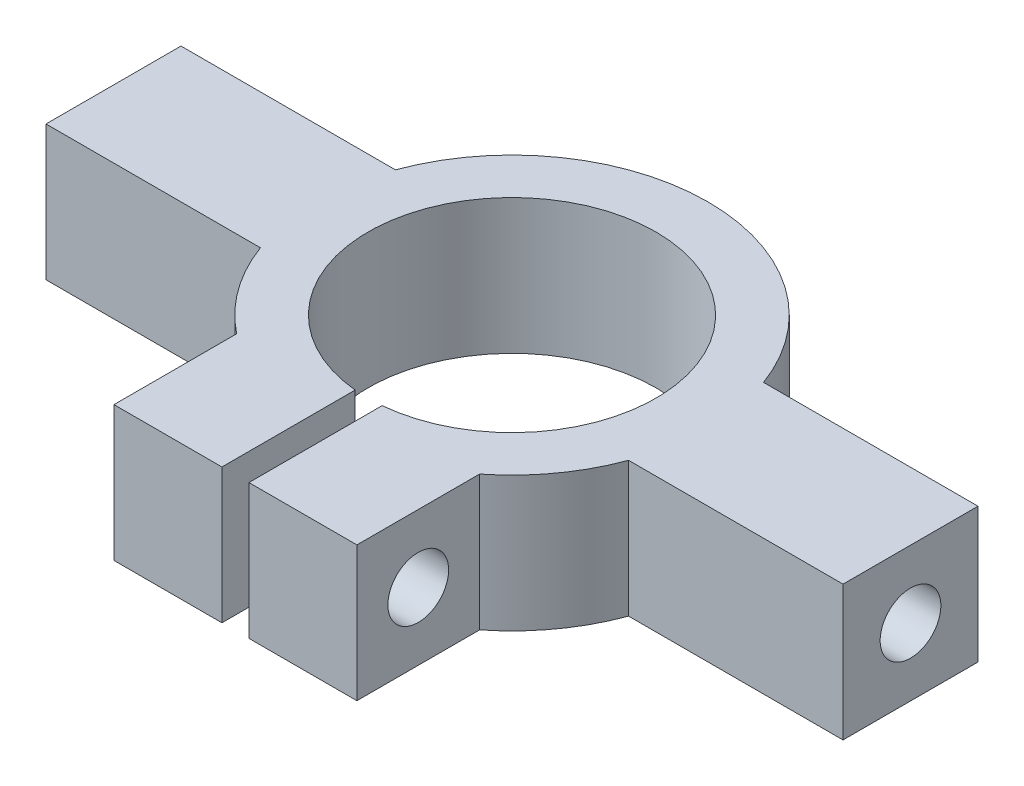
ISO-10303-21;
HEADER;
FILE_DESCRIPTION(('STEP AP214'),'2;1');
FILE_NAME('part.step','',(''),(''),'','','');
FILE_SCHEMA(('AUTOMOTIVE_DESIGN { 1 0 10303 214 1 1 1 1 }'));
ENDSEC;
DATA;
#1=APPLICATION_CONTEXT('core data for automotive mechanical design processes');
#2=APPLICATION_PROTOCOL_DEFINITION('international standard','automotive_design',2000,#1);
#3=PRODUCT_CONTEXT('',#1,'mechanical');
#4=PRODUCT('Part','Part','',(#3));
#5=PRODUCT_RELATED_PRODUCT_CATEGORY('part','',(#4));
#6=PRODUCT_DEFINITION_FORMATION('','',#4);
#7=PRODUCT_DEFINITION_CONTEXT('part definition',#1,'design');
#8=PRODUCT_DEFINITION('design','',#6,#7);
#9=PRODUCT_DEFINITION_SHAPE('','',#8);
#10=(LENGTH_UNIT() NAMED_UNIT(*) SI_UNIT(.MILLI.,.METRE.));
#11=(NAMED_UNIT(*) PLANE_ANGLE_UNIT() SI_UNIT($,.RADIAN.));
#12=(NAMED_UNIT(*) SI_UNIT($,.STERADIAN.) SOLID_ANGLE_UNIT());
#13=UNCERTAINTY_MEASURE_WITH_UNIT(LENGTH_MEASURE(1.E-05),#10,'distance_accuracy_value','');
#14=(GEOMETRIC_REPRESENTATION_CONTEXT(3) GLOBAL_UNCERTAINTY_ASSIGNED_CONTEXT((#13)) GLOBAL_UNIT_ASSIGNED_CONTEXT((#10,
#11,#12)) REPRESENTATION_CONTEXT('',''));
#15=CARTESIAN_POINT('',(0.,0.,0.));
#16=DIRECTION('',(0.,0.,1.));
#17=DIRECTION('',(1.,0.,0.));
#18=AXIS2_PLACEMENT_3D('',#15,#16,#17);
#19=CARTESIAN_POINT('',(0.,5.,30.));
#20=DIRECTION('',(0.,-1.,0.));
#21=DIRECTION('',(0.,0.,-1.));
#22=AXIS2_PLACEMENT_3D('',#19,#20,#21);
#23=CYLINDRICAL_SURFACE('',#22,14.525);
#24=CARTESIAN_POINT('',(0.,5.,30.));
#25=DIRECTION('',(0.,1.,0.));
#26=DIRECTION('',(0.,0.,1.));
#27=AXIS2_PLACEMENT_3D('',#24,#25,#26);
#28=CIRCLE('',#27,14.525);
#29=CARTESIAN_POINT('',(13.6372880368496,5.,25.));
#30=VERTEX_POINT('',#29);
#31=CARTESIAN_POINT('',(-13.6372880368496,5.,25.));
#32=VERTEX_POINT('',#31);
#33=EDGE_CURVE('E281',#30,#32,#28,.T.);
#34=ORIENTED_EDGE('',*,*,#33,.F.);
#35=DIRECTION('',(0.,1.,0.));
#36=VECTOR('',#35,1.);
#37=CARTESIAN_POINT('',(13.6372880368496,-23.7728365311168,25.));
#38=LINE('',#37,#36);
#39=CARTESIAN_POINT('',(13.6372880368496,-5.,25.));
#40=VERTEX_POINT('',#39);
#41=EDGE_CURVE('E183',#40,#30,#38,.T.);
#42=ORIENTED_EDGE('',*,*,#41,.F.);
#43=CARTESIAN_POINT('',(0.,-5.,30.));
#44=DIRECTION('',(0.,1.,0.));
#45=DIRECTION('',(0.,0.,1.));
#46=AXIS2_PLACEMENT_3D('',#43,#44,#45);
#47=CIRCLE('',#46,14.525);
#48=CARTESIAN_POINT('',(-13.6372880368496,-5.,25.));
#49=VERTEX_POINT('',#48);
#50=EDGE_CURVE('E283',#40,#49,#47,.T.);
#51=ORIENTED_EDGE('',*,*,#50,.T.);
#52=DIRECTION('',(0.,1.,0.));
#53=VECTOR('',#52,1.);
#54=CARTESIAN_POINT('',(-13.6372880368496,-23.7728365311168,25.));
#55=LINE('',#54,#53);
#56=EDGE_CURVE('E66',#49,#32,#55,.T.);
#57=ORIENTED_EDGE('',*,*,#56,.T.);
#58=EDGE_LOOP('',(#34,#42,#51,#57));
#59=FACE_BOUND('',#58,.T.);
#60=ADVANCED_FACE('F43',(#59),#23,.T.);
#61=CARTESIAN_POINT('',(9.,-5.,41.4006852864203));
#62=VERTEX_POINT('',#61);
#63=CARTESIAN_POINT('',(13.6372880368496,-5.,35.));
#64=VERTEX_POINT('',#63);
#65=EDGE_CURVE('E282',#62,#64,#47,.T.);
#66=ORIENTED_EDGE('',*,*,#65,.T.);
#67=DIRECTION('',(0.,1.,0.));
#68=VECTOR('',#67,1.);
#69=CARTESIAN_POINT('',(13.6372880368496,-23.7728365311168,35.));
#70=LINE('',#69,#68);
#71=CARTESIAN_POINT('',(13.6372880368496,5.,35.));
#72=VERTEX_POINT('',#71);
#73=EDGE_CURVE('E168',#64,#72,#70,.T.);
#74=ORIENTED_EDGE('',*,*,#73,.T.);
#75=CARTESIAN_POINT('',(9.,5.,41.4006852864203));
#76=VERTEX_POINT('',#75);
#77=EDGE_CURVE('E177',#76,#72,#28,.T.);
#78=ORIENTED_EDGE('',*,*,#77,.F.);
#79=DIRECTION('',(0.,1.,0.));
#80=VECTOR('',#79,1.);
#81=CARTESIAN_POINT('',(9.,-17.1088967549045,41.4006852864203));
#82=LINE('',#81,#80);
#83=EDGE_CURVE('E254',#62,#76,#82,.T.);
#84=ORIENTED_EDGE('',*,*,#83,.F.);
#85=EDGE_LOOP('',(#66,#74,#78,#84));
#86=FACE_BOUND('',#85,.T.);
#87=ADVANCED_FACE('F344',(#86),#23,.T.);
#88=CARTESIAN_POINT('',(0.,5.,30.));
#89=DIRECTION('',(0.,1.,0.));
#90=DIRECTION('',(0.,0.,1.));
#91=AXIS2_PLACEMENT_3D('',#88,#89,#90);
#92=PLANE('',#91);
#93=DIRECTION('',(0.,0.,-1.));
#94=VECTOR('',#93,1.);
#95=CARTESIAN_POINT('',(9.,5.,50.4905357043831));
#96=LINE('',#95,#94);
#97=CARTESIAN_POINT('',(9.,5.,50.4905357043831));
#98=VERTEX_POINT('',#97);
#99=EDGE_CURVE('E253',#98,#76,#96,.T.);
#100=ORIENTED_EDGE('',*,*,#99,.T.);
#101=ORIENTED_EDGE('',*,*,#77,.T.);
#102=DIRECTION('',(1.,0.,0.));
#103=VECTOR('',#102,1.);
#104=CARTESIAN_POINT('',(29.525,5.,35.));
#105=LINE('',#104,#103);
#106=CARTESIAN_POINT('',(29.525,5.,35.));
#107=VERTEX_POINT('',#106);
#108=EDGE_CURVE('E161',#72,#107,#105,.T.);
#109=ORIENTED_EDGE('',*,*,#108,.T.);
#110=DIRECTION('',(0.,0.,-1.));
#111=VECTOR('',#110,1.);
#112=CARTESIAN_POINT('',(29.525,5.,35.));
#113=LINE('',#112,#111);
#114=CARTESIAN_POINT('',(29.525,5.,25.));
#115=VERTEX_POINT('',#114);
#116=EDGE_CURVE('E176',#107,#115,#113,.T.);
#117=ORIENTED_EDGE('',*,*,#116,.T.);
#118=DIRECTION('',(-1.,0.,0.));
#119=VECTOR('',#118,1.);
#120=CARTESIAN_POINT('',(29.525,5.,25.));
#121=LINE('',#120,#119);
#122=EDGE_CURVE('E178',#115,#30,#121,.T.);
#123=ORIENTED_EDGE('',*,*,#122,.T.);
#124=ORIENTED_EDGE('',*,*,#33,.T.);
#125=DIRECTION('',(-1.,0.,0.));
#126=VECTOR('',#125,1.);
#127=CARTESIAN_POINT('',(-29.525,5.,25.));
#128=LINE('',#127,#126);
#129=CARTESIAN_POINT('',(-29.525,5.,25.));
#130=VERTEX_POINT('',#129);
#131=EDGE_CURVE('E197',#32,#130,#128,.T.);
#132=ORIENTED_EDGE('',*,*,#131,.T.);
#133=DIRECTION('',(0.,0.,1.));
#134=VECTOR('',#133,1.);
#135=CARTESIAN_POINT('',(-29.525,5.,35.));
#136=LINE('',#135,#134);
#137=CARTESIAN_POINT('',(-29.525,5.,35.));
#138=VERTEX_POINT('',#137);
#139=EDGE_CURVE('E209',#130,#138,#136,.T.);
#140=ORIENTED_EDGE('',*,*,#139,.T.);
#141=DIRECTION('',(1.,0.,0.));
#142=VECTOR('',#141,1.);
#143=CARTESIAN_POINT('',(-29.525,5.,35.));
#144=LINE('',#143,#142);
#145=CARTESIAN_POINT('',(-13.6372880368496,5.,35.));
#146=VERTEX_POINT('',#145);
#147=EDGE_CURVE('E206',#138,#146,#144,.T.);
#148=ORIENTED_EDGE('',*,*,#147,.T.);
#149=CARTESIAN_POINT('',(-9.,5.,41.4006852864203));
#150=VERTEX_POINT('',#149);
#151=EDGE_CURVE('E58',#146,#150,#28,.T.);
#152=ORIENTED_EDGE('',*,*,#151,.T.);
#153=DIRECTION('',(0.,0.,1.));
#154=VECTOR('',#153,1.);
#155=CARTESIAN_POINT('',(-9.,5.,50.4905357043831));
#156=LINE('',#155,#154);
#157=CARTESIAN_POINT('',(-9.,5.,50.4905357043831));
#158=VERTEX_POINT('',#157);
#159=EDGE_CURVE('E233',#150,#158,#156,.T.);
#160=ORIENTED_EDGE('',*,*,#159,.T.);
#161=DIRECTION('',(1.,0.,0.));
#162=VECTOR('',#161,1.);
#163=CARTESIAN_POINT('',(-0.999999999999999,5.,50.490535704383));
#164=LINE('',#163,#162);
#165=CARTESIAN_POINT('',(-0.999999999999999,5.,50.490535704383));
#166=VERTEX_POINT('',#165);
#167=EDGE_CURVE('E236',#158,#166,#164,.T.);
#168=ORIENTED_EDGE('',*,*,#167,.T.);
#169=DIRECTION('',(0.,0.,1.));
#170=VECTOR('',#169,1.);
#171=CARTESIAN_POINT('',(-1.,5.,46.5965));
#172=LINE('',#171,#170);
#173=CARTESIAN_POINT('',(-1.,5.,40.6210274455911));
#174=VERTEX_POINT('',#173);
#175=EDGE_CURVE('E248',#174,#166,#172,.T.);
#176=ORIENTED_EDGE('',*,*,#175,.F.);
#177=CARTESIAN_POINT('',(0.,5.,30.));
#178=DIRECTION('',(0.,1.,0.));
#179=DIRECTION('',(0.,0.,1.));
#180=AXIS2_PLACEMENT_3D('',#177,#178,#179);
#181=CIRCLE('',#180,10.668);
#182=CARTESIAN_POINT('',(1.,5.,40.6210274455911));
#183=VERTEX_POINT('',#182);
#184=EDGE_CURVE('E274',#183,#174,#181,.T.);
#185=ORIENTED_EDGE('',*,*,#184,.F.);
#186=DIRECTION('',(0.,0.,-1.));
#187=VECTOR('',#186,1.);
#188=CARTESIAN_POINT('',(1.,5.,46.5965));
#189=LINE('',#188,#187);
#190=CARTESIAN_POINT('',(0.999999999999999,5.,50.490535704383));
#191=VERTEX_POINT('',#190);
#192=EDGE_CURVE('E268',#191,#183,#189,.T.);
#193=ORIENTED_EDGE('',*,*,#192,.F.);
#194=DIRECTION('',(1.,0.,0.));
#195=VECTOR('',#194,1.);
#196=CARTESIAN_POINT('',(0.999999999999999,5.,50.490535704383));
#197=LINE('',#196,#195);
#198=EDGE_CURVE('E237',#191,#98,#197,.T.);
#199=ORIENTED_EDGE('',*,*,#198,.T.);
#200=EDGE_LOOP('',(#100,#101,#109,#117,#123,#124,#132,#140,#148,#152,#160,#168,#176,#185,#193,#199));
#201=FACE_BOUND('',#200,.T.);
#202=ADVANCED_FACE('F174',(#201),#92,.T.);
#203=CARTESIAN_POINT('',(0.,-5.,30.));
#204=DIRECTION('',(0.,1.,0.));
#205=DIRECTION('',(0.,0.,1.));
#206=AXIS2_PLACEMENT_3D('',#203,#204,#205);
#207=PLANE('',#206);
#208=ORIENTED_EDGE('',*,*,#65,.F.);
#209=DIRECTION('',(0.,0.,1.));
#210=VECTOR('',#209,1.);
#211=CARTESIAN_POINT('',(9.,-5.,50.4905357043831));
#212=LINE('',#211,#210);
#213=CARTESIAN_POINT('',(9.,-5.,50.4905357043831));
#214=VERTEX_POINT('',#213);
#215=EDGE_CURVE('E228',#62,#214,#212,.T.);
#216=ORIENTED_EDGE('',*,*,#215,.T.);
#217=DIRECTION('',(-1.,0.,0.));
#218=VECTOR('',#217,1.);
#219=CARTESIAN_POINT('',(0.999999999999999,-5.,50.490535704383));
#220=LINE('',#219,#218);
#221=CARTESIAN_POINT('',(0.999999999999999,-5.,50.490535704383));
#222=VERTEX_POINT('',#221);
#223=EDGE_CURVE('E250',#214,#222,#220,.T.);
#224=ORIENTED_EDGE('',*,*,#223,.T.);
#225=DIRECTION('',(0.,0.,-1.));
#226=VECTOR('',#225,1.);
#227=CARTESIAN_POINT('',(1.,-5.,46.5965));
#228=LINE('',#227,#226);
#229=CARTESIAN_POINT('',(1.,-5.,40.6210274455911));
#230=VERTEX_POINT('',#229);
#231=EDGE_CURVE('E267',#222,#230,#228,.T.);
#232=ORIENTED_EDGE('',*,*,#231,.T.);
#233=CARTESIAN_POINT('',(0.,-5.,30.));
#234=DIRECTION('',(0.,1.,0.));
#235=DIRECTION('',(0.,0.,1.));
#236=AXIS2_PLACEMENT_3D('',#233,#234,#235);
#237=CIRCLE('',#236,10.668);
#238=CARTESIAN_POINT('',(-1.,-5.,40.6210274455911));
#239=VERTEX_POINT('',#238);
#240=EDGE_CURVE('E271',#230,#239,#237,.T.);
#241=ORIENTED_EDGE('',*,*,#240,.T.);
#242=DIRECTION('',(0.,0.,1.));
#243=VECTOR('',#242,1.);
#244=CARTESIAN_POINT('',(-1.,-5.,46.5965));
#245=LINE('',#244,#243);
#246=CARTESIAN_POINT('',(-0.999999999999999,-5.,50.490535704383));
#247=VERTEX_POINT('',#246);
#248=EDGE_CURVE('E265',#239,#247,#245,.T.);
#249=ORIENTED_EDGE('',*,*,#248,.T.);
#250=DIRECTION('',(-1.,0.,0.));
#251=VECTOR('',#250,1.);
#252=CARTESIAN_POINT('',(-0.999999999999999,-5.,50.490535704383));
#253=LINE('',#252,#251);
#254=CARTESIAN_POINT('',(-9.,-5.,50.4905357043831));
#255=VERTEX_POINT('',#254);
#256=EDGE_CURVE('E229',#247,#255,#253,.T.);
#257=ORIENTED_EDGE('',*,*,#256,.T.);
#258=DIRECTION('',(0.,0.,-1.));
#259=VECTOR('',#258,1.);
#260=CARTESIAN_POINT('',(-9.,-5.,50.4905357043831));
#261=LINE('',#260,#259);
#262=CARTESIAN_POINT('',(-9.,-5.,41.4006852864203));
#263=VERTEX_POINT('',#262);
#264=EDGE_CURVE('E231',#255,#263,#261,.T.);
#265=ORIENTED_EDGE('',*,*,#264,.T.);
#266=CARTESIAN_POINT('',(-13.6372880368496,-5.00000000000001,35.));
#267=VERTEX_POINT('',#266);
#268=EDGE_CURVE('E277',#267,#263,#47,.T.);
#269=ORIENTED_EDGE('',*,*,#268,.F.);
#270=DIRECTION('',(-1.,0.,0.));
#271=VECTOR('',#270,1.);
#272=CARTESIAN_POINT('',(-29.525,-5.,35.));
#273=LINE('',#272,#271);
#274=CARTESIAN_POINT('',(-29.525,-5.,35.));
#275=VERTEX_POINT('',#274);
#276=EDGE_CURVE('E191',#267,#275,#273,.T.);
#277=ORIENTED_EDGE('',*,*,#276,.T.);
#278=DIRECTION('',(0.,0.,-1.));
#279=VECTOR('',#278,1.);
#280=CARTESIAN_POINT('',(-29.525,-5.,35.));
#281=LINE('',#280,#279);
#282=CARTESIAN_POINT('',(-29.525,-5.,25.));
#283=VERTEX_POINT('',#282);
#284=EDGE_CURVE('E193',#275,#283,#281,.T.);
#285=ORIENTED_EDGE('',*,*,#284,.T.);
#286=DIRECTION('',(1.,0.,0.));
#287=VECTOR('',#286,1.);
#288=CARTESIAN_POINT('',(-29.525,-5.,25.));
#289=LINE('',#288,#287);
#290=EDGE_CURVE('E203',#283,#49,#289,.T.);
#291=ORIENTED_EDGE('',*,*,#290,.T.);
#292=ORIENTED_EDGE('',*,*,#50,.F.);
#293=DIRECTION('',(1.,0.,0.));
#294=VECTOR('',#293,1.);
#295=CARTESIAN_POINT('',(29.525,-5.,25.));
#296=LINE('',#295,#294);
#297=CARTESIAN_POINT('',(29.525,-5.,25.));
#298=VERTEX_POINT('',#297);
#299=EDGE_CURVE('E219',#40,#298,#296,.T.);
#300=ORIENTED_EDGE('',*,*,#299,.T.);
#301=DIRECTION('',(0.,0.,1.));
#302=VECTOR('',#301,1.);
#303=CARTESIAN_POINT('',(29.525,-5.,35.));
#304=LINE('',#303,#302);
#305=CARTESIAN_POINT('',(29.525,-5.,35.));
#306=VERTEX_POINT('',#305);
#307=EDGE_CURVE('E422',#298,#306,#304,.T.);
#308=ORIENTED_EDGE('',*,*,#307,.T.);
#309=DIRECTION('',(-1.,0.,0.));
#310=VECTOR('',#309,1.);
#311=CARTESIAN_POINT('',(29.525,-5.,35.));
#312=LINE('',#311,#310);
#313=EDGE_CURVE('E163',#306,#64,#312,.T.);
#314=ORIENTED_EDGE('',*,*,#313,.T.);
#315=EDGE_LOOP('',(#208,#216,#224,#232,#241,#249,#257,#265,#269,#277,#285,#291,#292,#300,#308,#314));
#316=FACE_BOUND('',#315,.T.);
#317=ADVANCED_FACE('F291',(#316),#207,.F.);
#318=ORIENTED_EDGE('',*,*,#151,.F.);
#319=DIRECTION('',(0.,1.,0.));
#320=VECTOR('',#319,1.);
#321=CARTESIAN_POINT('',(-13.6372880368496,-23.7728365311168,35.));
#322=LINE('',#321,#320);
#323=EDGE_CURVE('E198',#267,#146,#322,.T.);
#324=ORIENTED_EDGE('',*,*,#323,.F.);
#325=ORIENTED_EDGE('',*,*,#268,.T.);
#326=DIRECTION('',(0.,1.,0.));
#327=VECTOR('',#326,1.);
#328=CARTESIAN_POINT('',(-9.,-17.1088967549045,41.4006852864203));
#329=LINE('',#328,#327);
#330=EDGE_CURVE('E240',#263,#150,#329,.T.);
#331=ORIENTED_EDGE('',*,*,#330,.T.);
#332=EDGE_LOOP('',(#318,#324,#325,#331));
#333=FACE_BOUND('',#332,.T.);
#334=ADVANCED_FACE('F45',(#333),#23,.T.);
#335=CARTESIAN_POINT('',(0.,5.,30.));
#336=DIRECTION('',(0.,-1.,0.));
#337=DIRECTION('',(0.,0.,-1.));
#338=AXIS2_PLACEMENT_3D('',#335,#336,#337);
#339=CYLINDRICAL_SURFACE('',#338,10.668);
#340=DIRECTION('',(0.,-1.,0.));
#341=VECTOR('',#340,1.);
#342=CARTESIAN_POINT('',(-1.,5.,40.6210274455911));
#343=LINE('',#342,#341);
#344=EDGE_CURVE('E11',#239,#174,#343,.F.);
#345=ORIENTED_EDGE('',*,*,#344,.F.);
#346=ORIENTED_EDGE('',*,*,#240,.F.);
#347=DIRECTION('',(0.,-1.,0.));
#348=VECTOR('',#347,1.);
#349=CARTESIAN_POINT('',(1.,5.,40.6210274455911));
#350=LINE('',#349,#348);
#351=EDGE_CURVE('E51',#183,#230,#350,.T.);
#352=ORIENTED_EDGE('',*,*,#351,.F.);
#353=ORIENTED_EDGE('',*,*,#184,.T.);
#354=EDGE_LOOP('',(#345,#346,#352,#353));
#355=FACE_BOUND('',#354,.T.);
#356=ADVANCED_FACE('F295',(#355),#339,.F.);
#357=CARTESIAN_POINT('',(1.,-5.,46.5965));
#358=DIRECTION('',(1.,0.,0.));
#359=DIRECTION('',(0.,0.,-1.));
#360=AXIS2_PLACEMENT_3D('',#357,#358,#359);
#361=PLANE('',#360);
#362=CARTESIAN_POINT('',(0.999999999999999,0.,45.9456104954017));
#363=DIRECTION('',(1.,0.,0.));
#364=DIRECTION('',(0.,0.,-1.));
#365=AXIS2_PLACEMENT_3D('',#362,#363,#364);
#366=CIRCLE('',#365,2.25);
#367=CARTESIAN_POINT('',(0.999999999999999,0.,43.6956104954017));
#368=VERTEX_POINT('',#367);
#369=EDGE_CURVE('E225',#368,#368,#366,.T.);
#370=ORIENTED_EDGE('',*,*,#369,.T.);
#371=EDGE_LOOP('',(#370));
#372=FACE_BOUND('',#371,.T.);
#373=ORIENTED_EDGE('',*,*,#192,.T.);
#374=ORIENTED_EDGE('',*,*,#351,.T.);
#375=ORIENTED_EDGE('',*,*,#231,.F.);
#376=DIRECTION('',(0.,1.,0.));
#377=VECTOR('',#376,1.);
#378=CARTESIAN_POINT('',(0.999999999999999,-17.1088967549045,50.490535704383));
#379=LINE('',#378,#377);
#380=EDGE_CURVE('E257',#222,#191,#379,.T.);
#381=ORIENTED_EDGE('',*,*,#380,.T.);
#382=EDGE_LOOP('',(#373,#374,#375,#381));
#383=FACE_BOUND('',#382,.T.);
#384=ADVANCED_FACE('F286',(#372,#383),#361,.F.);
#385=CARTESIAN_POINT('',(-1.,-5.,46.5965));
#386=DIRECTION('',(-1.,0.,0.));
#387=DIRECTION('',(0.,0.,1.));
#388=AXIS2_PLACEMENT_3D('',#385,#386,#387);
#389=PLANE('',#388);
#390=CARTESIAN_POINT('',(-0.999999999999999,0.,45.9456104954017));
#391=DIRECTION('',(-1.,0.,0.));
#392=DIRECTION('',(0.,0.,1.));
#393=AXIS2_PLACEMENT_3D('',#390,#391,#392);
#394=CIRCLE('',#393,2.25);
#395=CARTESIAN_POINT('',(-0.999999999999999,0.,48.1956104954017));
#396=VERTEX_POINT('',#395);
#397=EDGE_CURVE('E222',#396,#396,#394,.T.);
#398=ORIENTED_EDGE('',*,*,#397,.T.);
#399=EDGE_LOOP('',(#398));
#400=FACE_BOUND('',#399,.T.);
#401=ORIENTED_EDGE('',*,*,#248,.F.);
#402=ORIENTED_EDGE('',*,*,#344,.T.);
#403=ORIENTED_EDGE('',*,*,#175,.T.);
#404=DIRECTION('',(0.,1.,0.));
#405=VECTOR('',#404,1.);
#406=CARTESIAN_POINT('',(-0.999999999999999,-17.1088967549045,50.490535704383));
#407=LINE('',#406,#405);
#408=EDGE_CURVE('E232',#247,#166,#407,.T.);
#409=ORIENTED_EDGE('',*,*,#408,.F.);
#410=EDGE_LOOP('',(#401,#402,#403,#409));
#411=FACE_BOUND('',#410,.T.);
#412=ADVANCED_FACE('F298',(#400,#411),#389,.F.);
#413=CARTESIAN_POINT('',(-0.999999999999999,-17.1088967549045,50.490535704383));
#414=DIRECTION('',(0.,0.,1.));
#415=DIRECTION('',(1.,0.,0.));
#416=AXIS2_PLACEMENT_3D('',#413,#414,#415);
#417=PLANE('',#416);
#418=ORIENTED_EDGE('',*,*,#256,.F.);
#419=ORIENTED_EDGE('',*,*,#408,.T.);
#420=ORIENTED_EDGE('',*,*,#167,.F.);
#421=DIRECTION('',(0.,1.,0.));
#422=VECTOR('',#421,1.);
#423=CARTESIAN_POINT('',(-9.,-17.1088967549045,50.4905357043831));
#424=LINE('',#423,#422);
#425=EDGE_CURVE('E243',#255,#158,#424,.T.);
#426=ORIENTED_EDGE('',*,*,#425,.F.);
#427=EDGE_LOOP('',(#418,#419,#420,#426));
#428=FACE_BOUND('',#427,.T.);
#429=ADVANCED_FACE('F305',(#428),#417,.T.);
#430=CARTESIAN_POINT('',(-9.,-17.1088967549045,50.4905357043831));
#431=DIRECTION('',(-1.,0.,0.));
#432=DIRECTION('',(0.,0.,1.));
#433=AXIS2_PLACEMENT_3D('',#430,#431,#432);
#434=PLANE('',#433);
#435=CARTESIAN_POINT('',(-9.,0.,45.9456104954017));
#436=DIRECTION('',(-1.,0.,0.));
#437=DIRECTION('',(0.,0.,1.));
#438=AXIS2_PLACEMENT_3D('',#435,#436,#437);
#439=CIRCLE('',#438,2.25);
#440=CARTESIAN_POINT('',(-9.,0.,48.1956104954017));
#441=VERTEX_POINT('',#440);
#442=EDGE_CURVE('E218',#441,#441,#439,.F.);
#443=ORIENTED_EDGE('',*,*,#442,.T.);
#444=EDGE_LOOP('',(#443));
#445=FACE_BOUND('',#444,.T.);
#446=ORIENTED_EDGE('',*,*,#264,.F.);
#447=ORIENTED_EDGE('',*,*,#425,.T.);
#448=ORIENTED_EDGE('',*,*,#159,.F.);
#449=ORIENTED_EDGE('',*,*,#330,.F.);
#450=EDGE_LOOP('',(#446,#447,#448,#449));
#451=FACE_BOUND('',#450,.T.);
#452=ADVANCED_FACE('F309',(#445,#451),#434,.T.);
#453=CARTESIAN_POINT('',(0.999999999999999,-17.1088967549045,50.490535704383));
#454=DIRECTION('',(0.,0.,1.));
#455=DIRECTION('',(1.,0.,0.));
#456=AXIS2_PLACEMENT_3D('',#453,#454,#455);
#457=PLANE('',#456);
#458=ORIENTED_EDGE('',*,*,#223,.F.);
#459=DIRECTION('',(0.,1.,0.));
#460=VECTOR('',#459,1.);
#461=CARTESIAN_POINT('',(9.,-17.1088967549045,50.4905357043831));
#462=LINE('',#461,#460);
#463=EDGE_CURVE('E251',#214,#98,#462,.T.);
#464=ORIENTED_EDGE('',*,*,#463,.T.);
#465=ORIENTED_EDGE('',*,*,#198,.F.);
#466=ORIENTED_EDGE('',*,*,#380,.F.);
#467=EDGE_LOOP('',(#458,#464,#465,#466));
#468=FACE_BOUND('',#467,.T.);
#469=ADVANCED_FACE('F369',(#468),#457,.T.);
#470=CARTESIAN_POINT('',(9.,-17.1088967549045,50.4905357043831));
#471=DIRECTION('',(1.,0.,0.));
#472=DIRECTION('',(0.,0.,-1.));
#473=AXIS2_PLACEMENT_3D('',#470,#471,#472);
#474=PLANE('',#473);
#475=CARTESIAN_POINT('',(8.99999999999999,0.,45.9456104954017));
#476=DIRECTION('',(1.,0.,0.));
#477=DIRECTION('',(0.,0.,-1.));
#478=AXIS2_PLACEMENT_3D('',#475,#476,#477);
#479=CIRCLE('',#478,2.25);
#480=CARTESIAN_POINT('',(8.99999999999999,0.,43.6956104954017));
#481=VERTEX_POINT('',#480);
#482=EDGE_CURVE('E215',#481,#481,#479,.T.);
#483=ORIENTED_EDGE('',*,*,#482,.F.);
#484=EDGE_LOOP('',(#483));
#485=FACE_BOUND('',#484,.T.);
#486=ORIENTED_EDGE('',*,*,#215,.F.);
#487=ORIENTED_EDGE('',*,*,#83,.T.);
#488=ORIENTED_EDGE('',*,*,#99,.F.);
#489=ORIENTED_EDGE('',*,*,#463,.F.);
#490=EDGE_LOOP('',(#486,#487,#488,#489));
#491=FACE_BOUND('',#490,.T.);
#492=ADVANCED_FACE('F366',(#485,#491),#474,.T.);
#493=CARTESIAN_POINT('',(-15.3639610306789,0.,45.9456104954017));
#494=DIRECTION('',(1.,0.,0.));
#495=DIRECTION('',(0.,0.,-1.));
#496=AXIS2_PLACEMENT_3D('',#493,#494,#495);
#497=CYLINDRICAL_SURFACE('',#496,2.25);
#498=ORIENTED_EDGE('',*,*,#482,.T.);
#499=EDGE_LOOP('',(#498));
#500=FACE_BOUND('',#499,.T.);
#501=ORIENTED_EDGE('',*,*,#369,.F.);
#502=EDGE_LOOP('',(#501));
#503=FACE_BOUND('',#502,.T.);
#504=ADVANCED_FACE('F337',(#500,#503),#497,.F.);
#505=ORIENTED_EDGE('',*,*,#442,.F.);
#506=EDGE_LOOP('',(#505));
#507=FACE_BOUND('',#506,.T.);
#508=ORIENTED_EDGE('',*,*,#397,.F.);
#509=EDGE_LOOP('',(#508));
#510=FACE_BOUND('',#509,.T.);
#511=ADVANCED_FACE('F327',(#507,#510),#497,.F.);
#512=CARTESIAN_POINT('',(-29.525,-23.7728365311168,35.));
#513=DIRECTION('',(-1.,0.,0.));
#514=DIRECTION('',(0.,0.,1.));
#515=AXIS2_PLACEMENT_3D('',#512,#513,#514);
#516=PLANE('',#515);
#517=CARTESIAN_POINT('',(-29.525,0.,30.));
#518=DIRECTION('',(1.,0.,0.));
#519=DIRECTION('',(0.,0.,-1.));
#520=AXIS2_PLACEMENT_3D('',#517,#518,#519);
#521=CIRCLE('',#520,2.25);
#522=CARTESIAN_POINT('',(-29.525,0.,27.75));
#523=VERTEX_POINT('',#522);
#524=EDGE_CURVE('E413',#523,#523,#521,.T.);
#525=ORIENTED_EDGE('',*,*,#524,.T.);
#526=EDGE_LOOP('',(#525));
#527=FACE_BOUND('',#526,.T.);
#528=ORIENTED_EDGE('',*,*,#284,.F.);
#529=DIRECTION('',(0.,1.,0.));
#530=VECTOR('',#529,1.);
#531=CARTESIAN_POINT('',(-29.525,-23.7728365311168,35.));
#532=LINE('',#531,#530);
#533=EDGE_CURVE('E195',#275,#138,#532,.T.);
#534=ORIENTED_EDGE('',*,*,#533,.T.);
#535=ORIENTED_EDGE('',*,*,#139,.F.);
#536=DIRECTION('',(0.,1.,0.));
#537=VECTOR('',#536,1.);
#538=CARTESIAN_POINT('',(-29.525,-23.7728365311168,25.));
#539=LINE('',#538,#537);
#540=EDGE_CURVE('E201',#283,#130,#539,.T.);
#541=ORIENTED_EDGE('',*,*,#540,.F.);
#542=EDGE_LOOP('',(#528,#534,#535,#541));
#543=FACE_BOUND('',#542,.T.);
#544=ADVANCED_FACE('F325',(#527,#543),#516,.T.);
#545=CARTESIAN_POINT('',(-29.525,-23.7728365311168,25.));
#546=DIRECTION('',(0.,0.,-1.));
#547=DIRECTION('',(-1.,0.,0.));
#548=AXIS2_PLACEMENT_3D('',#545,#546,#547);
#549=PLANE('',#548);
#550=ORIENTED_EDGE('',*,*,#290,.F.);
#551=ORIENTED_EDGE('',*,*,#540,.T.);
#552=ORIENTED_EDGE('',*,*,#131,.F.);
#553=ORIENTED_EDGE('',*,*,#56,.F.);
#554=EDGE_LOOP('',(#550,#551,#552,#553));
#555=FACE_BOUND('',#554,.T.);
#556=ADVANCED_FACE('F318',(#555),#549,.T.);
#557=CARTESIAN_POINT('',(-29.525,-23.7728365311168,35.));
#558=DIRECTION('',(0.,0.,1.));
#559=DIRECTION('',(1.,0.,0.));
#560=AXIS2_PLACEMENT_3D('',#557,#558,#559);
#561=PLANE('',#560);
#562=ORIENTED_EDGE('',*,*,#276,.F.);
#563=ORIENTED_EDGE('',*,*,#323,.T.);
#564=ORIENTED_EDGE('',*,*,#147,.F.);
#565=ORIENTED_EDGE('',*,*,#533,.F.);
#566=EDGE_LOOP('',(#562,#563,#564,#565));
#567=FACE_BOUND('',#566,.T.);
#568=ADVANCED_FACE('F323',(#567),#561,.T.);
#569=CARTESIAN_POINT('',(29.525,-23.7728365311168,25.));
#570=DIRECTION('',(0.,0.,-1.));
#571=DIRECTION('',(-1.,0.,0.));
#572=AXIS2_PLACEMENT_3D('',#569,#570,#571);
#573=PLANE('',#572);
#574=ORIENTED_EDGE('',*,*,#299,.F.);
#575=ORIENTED_EDGE('',*,*,#41,.T.);
#576=ORIENTED_EDGE('',*,*,#122,.F.);
#577=DIRECTION('',(0.,1.,0.));
#578=VECTOR('',#577,1.);
#579=CARTESIAN_POINT('',(29.525,-23.7728365311168,25.));
#580=LINE('',#579,#578);
#581=EDGE_CURVE('E167',#298,#115,#580,.T.);
#582=ORIENTED_EDGE('',*,*,#581,.F.);
#583=EDGE_LOOP('',(#574,#575,#576,#582));
#584=FACE_BOUND('',#583,.T.);
#585=ADVANCED_FACE('F381',(#584),#573,.T.);
#586=CARTESIAN_POINT('',(29.525,-23.7728365311168,35.));
#587=DIRECTION('',(1.,0.,0.));
#588=DIRECTION('',(0.,0.,-1.));
#589=AXIS2_PLACEMENT_3D('',#586,#587,#588);
#590=PLANE('',#589);
#591=CARTESIAN_POINT('',(29.525,0.,30.));
#592=DIRECTION('',(1.,0.,0.));
#593=DIRECTION('',(0.,0.,-1.));
#594=AXIS2_PLACEMENT_3D('',#591,#592,#593);
#595=CIRCLE('',#594,2.25);
#596=CARTESIAN_POINT('',(29.525,0.,27.75));
#597=VERTEX_POINT('',#596);
#598=EDGE_CURVE('E412',#597,#597,#595,.T.);
#599=ORIENTED_EDGE('',*,*,#598,.F.);
#600=EDGE_LOOP('',(#599));
#601=FACE_BOUND('',#600,.T.);
#602=ORIENTED_EDGE('',*,*,#307,.F.);
#603=ORIENTED_EDGE('',*,*,#581,.T.);
#604=ORIENTED_EDGE('',*,*,#116,.F.);
#605=DIRECTION('',(0.,1.,0.));
#606=VECTOR('',#605,1.);
#607=CARTESIAN_POINT('',(29.525,-23.7728365311168,35.));
#608=LINE('',#607,#606);
#609=EDGE_CURVE('E157',#306,#107,#608,.T.);
#610=ORIENTED_EDGE('',*,*,#609,.F.);
#611=EDGE_LOOP('',(#602,#603,#604,#610));
#612=FACE_BOUND('',#611,.T.);
#613=ADVANCED_FACE('F180',(#601,#612),#590,.T.);
#614=CARTESIAN_POINT('',(29.525,-23.7728365311168,35.));
#615=DIRECTION('',(0.,0.,1.));
#616=DIRECTION('',(1.,0.,0.));
#617=AXIS2_PLACEMENT_3D('',#614,#615,#616);
#618=PLANE('',#617);
#619=ORIENTED_EDGE('',*,*,#313,.F.);
#620=ORIENTED_EDGE('',*,*,#609,.T.);
#621=ORIENTED_EDGE('',*,*,#108,.F.);
#622=ORIENTED_EDGE('',*,*,#73,.F.);
#623=EDGE_LOOP('',(#619,#620,#621,#622));
#624=FACE_BOUND('',#623,.T.);
#625=ADVANCED_FACE('F159',(#624),#618,.T.);
#626=CARTESIAN_POINT('',(19.525,0.,30.));
#627=DIRECTION('',(1.,0.,0.));
#628=DIRECTION('',(0.,0.,-1.));
#629=AXIS2_PLACEMENT_3D('',#626,#627,#628);
#630=CYLINDRICAL_SURFACE('',#629,2.25);
#631=CARTESIAN_POINT('',(19.525,0.,30.));
#632=DIRECTION('',(1.,0.,0.));
#633=DIRECTION('',(0.,0.,-1.));
#634=AXIS2_PLACEMENT_3D('',#631,#632,#633);
#635=CIRCLE('',#634,2.25);
#636=CARTESIAN_POINT('',(19.525,0.,27.75));
#637=VERTEX_POINT('',#636);
#638=EDGE_CURVE('E194',#637,#637,#635,.T.);
#639=ORIENTED_EDGE('',*,*,#638,.F.);
#640=EDGE_LOOP('',(#639));
#641=FACE_BOUND('',#640,.T.);
#642=ORIENTED_EDGE('',*,*,#598,.T.);
#643=EDGE_LOOP('',(#642));
#644=FACE_BOUND('',#643,.T.);
#645=ADVANCED_FACE('F393',(#641,#644),#630,.F.);
#646=CARTESIAN_POINT('',(19.525,0.,30.));
#647=DIRECTION('',(1.,0.,0.));
#648=DIRECTION('',(0.,0.,-1.));
#649=AXIS2_PLACEMENT_3D('',#646,#647,#648);
#650=PLANE('',#649);
#651=ORIENTED_EDGE('',*,*,#638,.T.);
#652=EDGE_LOOP('',(#651));
#653=FACE_BOUND('',#652,.T.);
#654=ADVANCED_FACE('F397',(#653),#650,.T.);
#655=CARTESIAN_POINT('',(-19.525,0.,30.));
#656=DIRECTION('',(-1.,0.,0.));
#657=DIRECTION('',(0.,0.,1.));
#658=AXIS2_PLACEMENT_3D('',#655,#656,#657);
#659=CYLINDRICAL_SURFACE('',#658,2.25);
#660=CARTESIAN_POINT('',(-19.525,0.,30.));
#661=DIRECTION('',(1.,0.,0.));
#662=DIRECTION('',(0.,0.,-1.));
#663=AXIS2_PLACEMENT_3D('',#660,#661,#662);
#664=CIRCLE('',#663,2.25);
#665=CARTESIAN_POINT('',(-19.525,0.,27.75));
#666=VERTEX_POINT('',#665);
#667=EDGE_CURVE('E411',#666,#666,#664,.T.);
#668=ORIENTED_EDGE('',*,*,#667,.T.);
#669=EDGE_LOOP('',(#668));
#670=FACE_BOUND('',#669,.T.);
#671=ORIENTED_EDGE('',*,*,#524,.F.);
#672=EDGE_LOOP('',(#671));
#673=FACE_BOUND('',#672,.T.);
#674=ADVANCED_FACE('F400',(#670,#673),#659,.F.);
#675=CARTESIAN_POINT('',(-19.525,0.,30.));
#676=DIRECTION('',(-1.,0.,0.));
#677=DIRECTION('',(0.,0.,-1.));
#678=AXIS2_PLACEMENT_3D('',#675,#676,#677);
#679=PLANE('',#678);
#680=ORIENTED_EDGE('',*,*,#667,.F.);
#681=EDGE_LOOP('',(#680));
#682=FACE_BOUND('',#681,.T.);
#683=ADVANCED_FACE('F403',(#682),#679,.T.);
#684=CLOSED_SHELL('',(#60,#87,#202,#317,#334,#356,#384,#412,#429,#452,#469,#492,#504,#511,#544,
#556,#568,#585,#613,#625,#645,#654,#674,#683));
#685=MANIFOLD_SOLID_BREP('B2',#684);
#686=ADVANCED_BREP_SHAPE_REPRESENTATION('',(#18,#685),#14);
#687=SHAPE_DEFINITION_REPRESENTATION(#9,#686);
ENDSEC;
END-ISO-10303-21;
